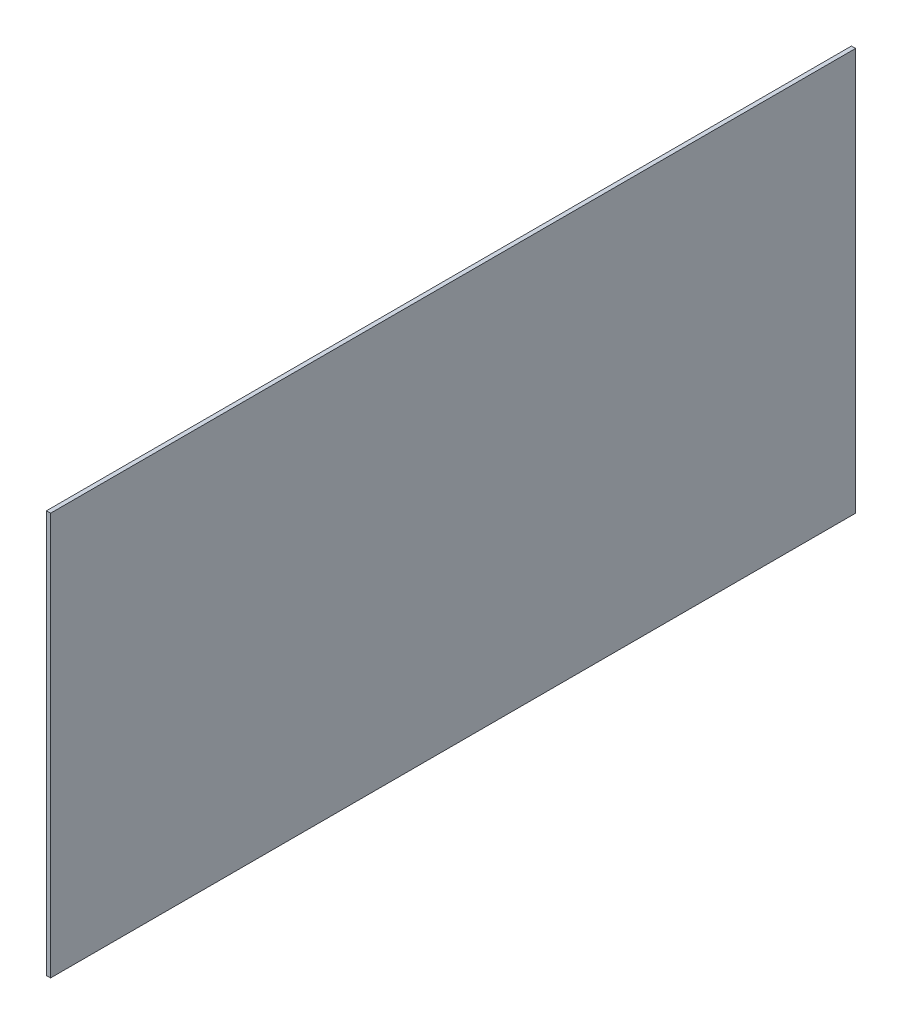
ISO-10303-21;
HEADER;
FILE_DESCRIPTION(('STEP AP214'),'2;1');
FILE_NAME('part.step','',(''),(''),'','','');
FILE_SCHEMA(('AUTOMOTIVE_DESIGN { 1 0 10303 214 1 1 1 1 }'));
ENDSEC;
DATA;
#1=APPLICATION_CONTEXT('core data for automotive mechanical design processes');
#2=APPLICATION_PROTOCOL_DEFINITION('international standard','automotive_design',2000,#1);
#3=PRODUCT_CONTEXT('',#1,'mechanical');
#4=PRODUCT('Part','Part','',(#3));
#5=PRODUCT_RELATED_PRODUCT_CATEGORY('part','',(#4));
#6=PRODUCT_DEFINITION_FORMATION('','',#4);
#7=PRODUCT_DEFINITION_CONTEXT('part definition',#1,'design');
#8=PRODUCT_DEFINITION('design','',#6,#7);
#9=PRODUCT_DEFINITION_SHAPE('','',#8);
#10=(LENGTH_UNIT() NAMED_UNIT(*) SI_UNIT(.MILLI.,.METRE.));
#11=(NAMED_UNIT(*) PLANE_ANGLE_UNIT() SI_UNIT($,.RADIAN.));
#12=(NAMED_UNIT(*) SI_UNIT($,.STERADIAN.) SOLID_ANGLE_UNIT());
#13=UNCERTAINTY_MEASURE_WITH_UNIT(LENGTH_MEASURE(1.E-05),#10,'distance_accuracy_value','');
#14=(GEOMETRIC_REPRESENTATION_CONTEXT(3) GLOBAL_UNCERTAINTY_ASSIGNED_CONTEXT((#13)) GLOBAL_UNIT_ASSIGNED_CONTEXT((#10,
#11,#12)) REPRESENTATION_CONTEXT('',''));
#15=CARTESIAN_POINT('',(0.,0.,0.));
#16=DIRECTION('',(0.,0.,1.));
#17=DIRECTION('',(1.,0.,0.));
#18=AXIS2_PLACEMENT_3D('',#15,#16,#17);
#19=CARTESIAN_POINT('',(3.,24.0390205228821,133.960612691466));
#20=DIRECTION('',(0.,0.,-1.));
#21=DIRECTION('',(0.,1.,0.));
#22=AXIS2_PLACEMENT_3D('',#19,#20,#21);
#23=PLANE('',#22);
#24=DIRECTION('',(0.,-1.,0.));
#25=VECTOR('',#24,1.);
#26=CARTESIAN_POINT('',(0.,24.0390205228821,133.960612691466));
#27=LINE('',#26,#25);
#28=CARTESIAN_POINT('',(0.,24.0390205228821,133.960612691466));
#29=VERTEX_POINT('',#28);
#30=CARTESIAN_POINT('',(0.,-265.960979477118,133.960612691466));
#31=VERTEX_POINT('',#30);
#32=EDGE_CURVE('E95',#29,#31,#27,.T.);
#33=ORIENTED_EDGE('',*,*,#32,.T.);
#34=DIRECTION('',(-1.,0.,0.));
#35=VECTOR('',#34,1.);
#36=CARTESIAN_POINT('',(3.,-265.960979477118,133.960612691466));
#37=LINE('',#36,#35);
#38=CARTESIAN_POINT('',(3.,-265.960979477118,133.960612691466));
#39=VERTEX_POINT('',#38);
#40=EDGE_CURVE('E11',#39,#31,#37,.T.);
#41=ORIENTED_EDGE('',*,*,#40,.F.);
#42=DIRECTION('',(0.,-1.,0.));
#43=VECTOR('',#42,1.);
#44=CARTESIAN_POINT('',(3.,24.0390205228821,133.960612691466));
#45=LINE('',#44,#43);
#46=CARTESIAN_POINT('',(3.,24.0390205228821,133.960612691466));
#47=VERTEX_POINT('',#46);
#48=EDGE_CURVE('E83',#47,#39,#45,.T.);
#49=ORIENTED_EDGE('',*,*,#48,.F.);
#50=DIRECTION('',(-1.,0.,0.));
#51=VECTOR('',#50,1.);
#52=CARTESIAN_POINT('',(3.,24.0390205228821,133.960612691466));
#53=LINE('',#52,#51);
#54=EDGE_CURVE('E91',#47,#29,#53,.T.);
#55=ORIENTED_EDGE('',*,*,#54,.T.);
#56=EDGE_LOOP('',(#33,#41,#49,#55));
#57=FACE_BOUND('',#56,.T.);
#58=ADVANCED_FACE('F32',(#57),#23,.F.);
#59=CARTESIAN_POINT('',(3.,-265.960979477118,133.960612691466));
#60=DIRECTION('',(0.,1.,0.));
#61=DIRECTION('',(0.,0.,1.));
#62=AXIS2_PLACEMENT_3D('',#59,#60,#61);
#63=PLANE('',#62);
#64=DIRECTION('',(0.,0.,-1.));
#65=VECTOR('',#64,1.);
#66=CARTESIAN_POINT('',(0.,-265.960979477118,133.960612691466));
#67=LINE('',#66,#65);
#68=CARTESIAN_POINT('',(0.,-265.960979477118,-446.039387308534));
#69=VERTEX_POINT('',#68);
#70=EDGE_CURVE('E87',#31,#69,#67,.T.);
#71=ORIENTED_EDGE('',*,*,#70,.T.);
#72=DIRECTION('',(-1.,0.,0.));
#73=VECTOR('',#72,1.);
#74=CARTESIAN_POINT('',(3.,-265.960979477118,-446.039387308534));
#75=LINE('',#74,#73);
#76=CARTESIAN_POINT('',(3.,-265.960979477118,-446.039387308534));
#77=VERTEX_POINT('',#76);
#78=EDGE_CURVE('E40',#77,#69,#75,.T.);
#79=ORIENTED_EDGE('',*,*,#78,.F.);
#80=DIRECTION('',(0.,0.,-1.));
#81=VECTOR('',#80,1.);
#82=CARTESIAN_POINT('',(3.,-265.960979477118,133.960612691466));
#83=LINE('',#82,#81);
#84=EDGE_CURVE('E78',#39,#77,#83,.T.);
#85=ORIENTED_EDGE('',*,*,#84,.F.);
#86=ORIENTED_EDGE('',*,*,#40,.T.);
#87=EDGE_LOOP('',(#71,#79,#85,#86));
#88=FACE_BOUND('',#87,.T.);
#89=ADVANCED_FACE('F86',(#88),#63,.F.);
#90=CARTESIAN_POINT('',(3.,24.0390205228821,-446.039387308534));
#91=DIRECTION('',(0.,0.,1.));
#92=DIRECTION('',(0.,-1.,0.));
#93=AXIS2_PLACEMENT_3D('',#90,#91,#92);
#94=PLANE('',#93);
#95=DIRECTION('',(0.,1.,0.));
#96=VECTOR('',#95,1.);
#97=CARTESIAN_POINT('',(0.,24.0390205228821,-446.039387308534));
#98=LINE('',#97,#96);
#99=CARTESIAN_POINT('',(0.,24.0390205228821,-446.039387308534));
#100=VERTEX_POINT('',#99);
#101=EDGE_CURVE('E65',#69,#100,#98,.T.);
#102=ORIENTED_EDGE('',*,*,#101,.T.);
#103=DIRECTION('',(-1.,0.,0.));
#104=VECTOR('',#103,1.);
#105=CARTESIAN_POINT('',(3.,24.0390205228821,-446.039387308534));
#106=LINE('',#105,#104);
#107=CARTESIAN_POINT('',(3.,24.0390205228821,-446.039387308534));
#108=VERTEX_POINT('',#107);
#109=EDGE_CURVE('E88',#108,#100,#106,.T.);
#110=ORIENTED_EDGE('',*,*,#109,.F.);
#111=DIRECTION('',(0.,1.,0.));
#112=VECTOR('',#111,1.);
#113=CARTESIAN_POINT('',(3.,24.0390205228821,-446.039387308534));
#114=LINE('',#113,#112);
#115=EDGE_CURVE('E81',#77,#108,#114,.T.);
#116=ORIENTED_EDGE('',*,*,#115,.F.);
#117=ORIENTED_EDGE('',*,*,#78,.T.);
#118=EDGE_LOOP('',(#102,#110,#116,#117));
#119=FACE_BOUND('',#118,.T.);
#120=ADVANCED_FACE('F89',(#119),#94,.F.);
#121=CARTESIAN_POINT('',(3.,24.0390205228821,133.960612691466));
#122=DIRECTION('',(0.,-1.,0.));
#123=DIRECTION('',(0.,0.,-1.));
#124=AXIS2_PLACEMENT_3D('',#121,#122,#123);
#125=PLANE('',#124);
#126=DIRECTION('',(0.,0.,1.));
#127=VECTOR('',#126,1.);
#128=CARTESIAN_POINT('',(0.,24.0390205228821,133.960612691466));
#129=LINE('',#128,#127);
#130=EDGE_CURVE('E71',#100,#29,#129,.T.);
#131=ORIENTED_EDGE('',*,*,#130,.T.);
#132=ORIENTED_EDGE('',*,*,#54,.F.);
#133=DIRECTION('',(0.,0.,1.));
#134=VECTOR('',#133,1.);
#135=CARTESIAN_POINT('',(3.,24.0390205228821,133.960612691466));
#136=LINE('',#135,#134);
#137=EDGE_CURVE('E48',#108,#47,#136,.T.);
#138=ORIENTED_EDGE('',*,*,#137,.F.);
#139=ORIENTED_EDGE('',*,*,#109,.T.);
#140=EDGE_LOOP('',(#131,#132,#138,#139));
#141=FACE_BOUND('',#140,.T.);
#142=ADVANCED_FACE('F102',(#141),#125,.F.);
#143=CARTESIAN_POINT('',(3.,0.,0.));
#144=DIRECTION('',(1.,0.,0.));
#145=DIRECTION('',(0.,0.,-1.));
#146=AXIS2_PLACEMENT_3D('',#143,#144,#145);
#147=PLANE('',#146);
#148=ORIENTED_EDGE('',*,*,#48,.T.);
#149=ORIENTED_EDGE('',*,*,#84,.T.);
#150=ORIENTED_EDGE('',*,*,#115,.T.);
#151=ORIENTED_EDGE('',*,*,#137,.T.);
#152=EDGE_LOOP('',(#148,#149,#150,#151));
#153=FACE_BOUND('',#152,.T.);
#154=ADVANCED_FACE('F79',(#153),#147,.T.);
#155=CARTESIAN_POINT('',(0.,0.,0.));
#156=DIRECTION('',(1.,0.,0.));
#157=DIRECTION('',(0.,0.,-1.));
#158=AXIS2_PLACEMENT_3D('',#155,#156,#157);
#159=PLANE('',#158);
#160=ORIENTED_EDGE('',*,*,#32,.F.);
#161=ORIENTED_EDGE('',*,*,#130,.F.);
#162=ORIENTED_EDGE('',*,*,#101,.F.);
#163=ORIENTED_EDGE('',*,*,#70,.F.);
#164=EDGE_LOOP('',(#160,#161,#162,#163));
#165=FACE_BOUND('',#164,.T.);
#166=ADVANCED_FACE('F105',(#165),#159,.F.);
#167=CLOSED_SHELL('',(#58,#89,#120,#142,#154,#166));
#168=MANIFOLD_SOLID_BREP('B2',#167);
#169=ADVANCED_BREP_SHAPE_REPRESENTATION('',(#18,#168),#14);
#170=SHAPE_DEFINITION_REPRESENTATION(#9,#169);
ENDSEC;
END-ISO-10303-21;
